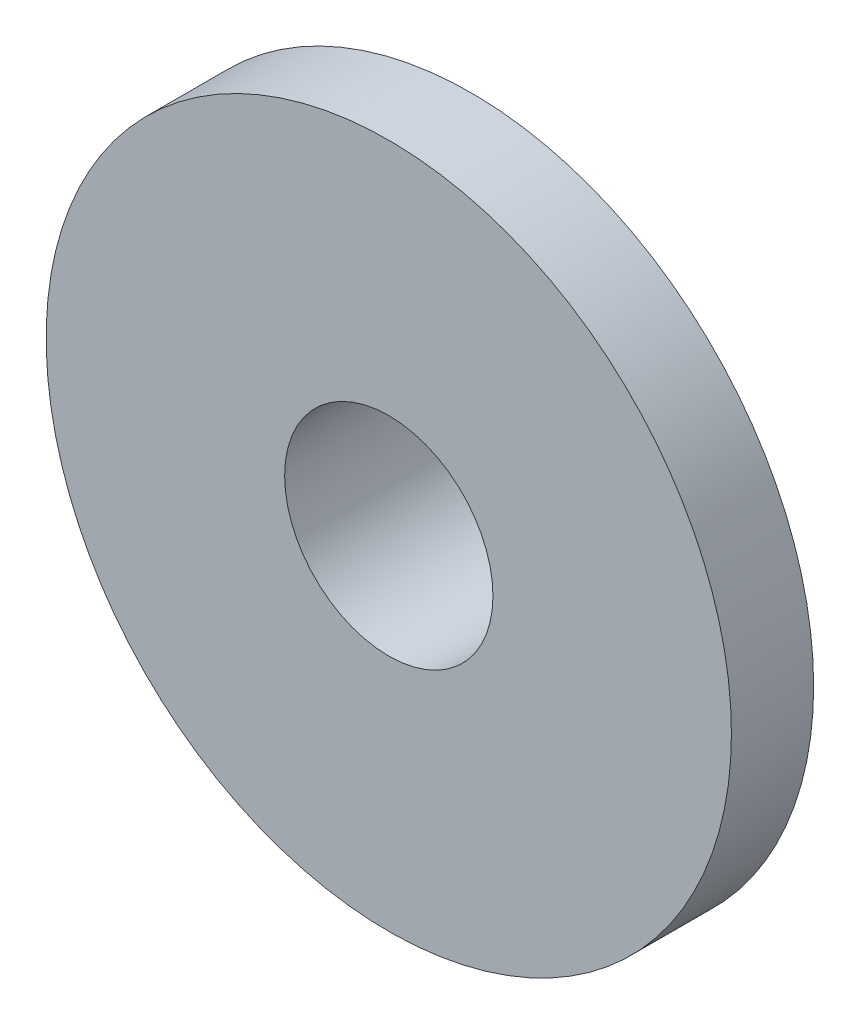
ISO-10303-21;
HEADER;
FILE_DESCRIPTION(('STEP AP214'),'2;1');
FILE_NAME('part.step','',(''),(''),'','','');
FILE_SCHEMA(('AUTOMOTIVE_DESIGN { 1 0 10303 214 1 1 1 1 }'));
ENDSEC;
DATA;
#1=APPLICATION_CONTEXT('core data for automotive mechanical design processes');
#2=APPLICATION_PROTOCOL_DEFINITION('international standard','automotive_design',2000,#1);
#3=PRODUCT_CONTEXT('',#1,'mechanical');
#4=PRODUCT('Part','Part','',(#3));
#5=PRODUCT_RELATED_PRODUCT_CATEGORY('part','',(#4));
#6=PRODUCT_DEFINITION_FORMATION('','',#4);
#7=PRODUCT_DEFINITION_CONTEXT('part definition',#1,'design');
#8=PRODUCT_DEFINITION('design','',#6,#7);
#9=PRODUCT_DEFINITION_SHAPE('','',#8);
#10=(LENGTH_UNIT() NAMED_UNIT(*) SI_UNIT(.MILLI.,.METRE.));
#11=(NAMED_UNIT(*) PLANE_ANGLE_UNIT() SI_UNIT($,.RADIAN.));
#12=(NAMED_UNIT(*) SI_UNIT($,.STERADIAN.) SOLID_ANGLE_UNIT());
#13=UNCERTAINTY_MEASURE_WITH_UNIT(LENGTH_MEASURE(1.E-05),#10,'distance_accuracy_value','');
#14=(GEOMETRIC_REPRESENTATION_CONTEXT(3) GLOBAL_UNCERTAINTY_ASSIGNED_CONTEXT((#13)) GLOBAL_UNIT_ASSIGNED_CONTEXT((#10,
#11,#12)) REPRESENTATION_CONTEXT('',''));
#15=CARTESIAN_POINT('',(0.,0.,0.));
#16=DIRECTION('',(0.,0.,1.));
#17=DIRECTION('',(1.,0.,0.));
#18=AXIS2_PLACEMENT_3D('',#15,#16,#17);
#19=CARTESIAN_POINT('',(0.,0.,13.));
#20=DIRECTION('',(0.,0.,-1.));
#21=DIRECTION('',(-1.,0.,0.));
#22=AXIS2_PLACEMENT_3D('',#19,#20,#21);
#23=CYLINDRICAL_SURFACE('',#22,11.5);
#24=CARTESIAN_POINT('',(0.,0.,0.));
#25=DIRECTION('',(0.,0.,1.));
#26=DIRECTION('',(1.,0.,0.));
#27=AXIS2_PLACEMENT_3D('',#24,#25,#26);
#28=CIRCLE('',#27,11.5);
#29=CARTESIAN_POINT('',(-11.5,0.,0.));
#30=VERTEX_POINT('',#29);
#31=EDGE_CURVE('E46',#30,#30,#28,.T.);
#32=CARTESIAN_POINT('',(0.,0.,7.));
#33=DIRECTION('',(0.,0.,1.));
#34=DIRECTION('',(1.,0.,0.));
#35=AXIS2_PLACEMENT_3D('',#32,#33,#34);
#36=CIRCLE('',#35,11.5);
#37=CARTESIAN_POINT('',(-11.5,0.,7.));
#38=VERTEX_POINT('',#37);
#39=EDGE_CURVE('E10',#38,#38,#36,.T.);
#40=CARTESIAN_POINT('',(-11.5,0.,0.));
#41=CARTESIAN_POINT('',(-11.5,0.,0.0729166666666666));
#42=CARTESIAN_POINT('',(-11.5,0.,0.145833333333333));
#43=CARTESIAN_POINT('',(-11.5,0.,0.291666666666667));
#44=CARTESIAN_POINT('',(-11.5,0.,0.364583333333334));
#45=CARTESIAN_POINT('',(-11.5,0.,0.510416666666667));
#46=CARTESIAN_POINT('',(-11.5,0.,0.583333333333334));
#47=CARTESIAN_POINT('',(-11.5,0.,0.729166666666667));
#48=CARTESIAN_POINT('',(-11.5,0.,0.802083333333334));
#49=CARTESIAN_POINT('',(-11.5,0.,0.947916666666667));
#50=CARTESIAN_POINT('',(-11.5,0.,1.02083333333333));
#51=CARTESIAN_POINT('',(-11.5,0.,1.16666666666667));
#52=CARTESIAN_POINT('',(-11.5,0.,1.23958333333333));
#53=CARTESIAN_POINT('',(-11.5,0.,1.38541666666667));
#54=CARTESIAN_POINT('',(-11.5,0.,1.45833333333333));
#55=CARTESIAN_POINT('',(-11.5,0.,1.60416666666667));
#56=CARTESIAN_POINT('',(-11.5,0.,1.67708333333333));
#57=CARTESIAN_POINT('',(-11.5,0.,1.82291666666667));
#58=CARTESIAN_POINT('',(-11.5,0.,1.89583333333333));
#59=CARTESIAN_POINT('',(-11.5,0.,2.04166666666667));
#60=CARTESIAN_POINT('',(-11.5,0.,2.11458333333333));
#61=CARTESIAN_POINT('',(-11.5,0.,2.26041666666667));
#62=CARTESIAN_POINT('',(-11.5,0.,2.33333333333333));
#63=CARTESIAN_POINT('',(-11.5,0.,2.47916666666667));
#64=CARTESIAN_POINT('',(-11.5,0.,2.55208333333333));
#65=CARTESIAN_POINT('',(-11.5,0.,2.69791666666667));
#66=CARTESIAN_POINT('',(-11.5,0.,2.77083333333333));
#67=CARTESIAN_POINT('',(-11.5,0.,2.91666666666667));
#68=CARTESIAN_POINT('',(-11.5,0.,2.98958333333333));
#69=CARTESIAN_POINT('',(-11.5,0.,3.13541666666667));
#70=CARTESIAN_POINT('',(-11.5,0.,3.20833333333333));
#71=CARTESIAN_POINT('',(-11.5,0.,3.35416666666667));
#72=CARTESIAN_POINT('',(-11.5,0.,3.42708333333333));
#73=CARTESIAN_POINT('',(-11.5,0.,3.57291666666667));
#74=CARTESIAN_POINT('',(-11.5,0.,3.64583333333333));
#75=CARTESIAN_POINT('',(-11.5,0.,3.79166666666667));
#76=CARTESIAN_POINT('',(-11.5,0.,3.86458333333333));
#77=CARTESIAN_POINT('',(-11.5,0.,4.01041666666667));
#78=CARTESIAN_POINT('',(-11.5,0.,4.08333333333333));
#79=CARTESIAN_POINT('',(-11.5,0.,4.22916666666667));
#80=CARTESIAN_POINT('',(-11.5,0.,4.30208333333333));
#81=CARTESIAN_POINT('',(-11.5,0.,4.44791666666667));
#82=CARTESIAN_POINT('',(-11.5,0.,4.52083333333333));
#83=CARTESIAN_POINT('',(-11.5,0.,4.66666666666667));
#84=CARTESIAN_POINT('',(-11.5,0.,4.73958333333333));
#85=CARTESIAN_POINT('',(-11.5,0.,4.88541666666667));
#86=CARTESIAN_POINT('',(-11.5,0.,4.95833333333333));
#87=CARTESIAN_POINT('',(-11.5,0.,5.10416666666667));
#88=CARTESIAN_POINT('',(-11.5,0.,5.17708333333333));
#89=CARTESIAN_POINT('',(-11.5,0.,5.32291666666667));
#90=CARTESIAN_POINT('',(-11.5,0.,5.39583333333333));
#91=CARTESIAN_POINT('',(-11.5,0.,5.54166666666667));
#92=CARTESIAN_POINT('',(-11.5,0.,5.61458333333333));
#93=CARTESIAN_POINT('',(-11.5,0.,5.76041666666667));
#94=CARTESIAN_POINT('',(-11.5,0.,5.83333333333333));
#95=CARTESIAN_POINT('',(-11.5,0.,5.97916666666667));
#96=CARTESIAN_POINT('',(-11.5,0.,6.05208333333333));
#97=CARTESIAN_POINT('',(-11.5,0.,6.19791666666667));
#98=CARTESIAN_POINT('',(-11.5,0.,6.27083333333333));
#99=CARTESIAN_POINT('',(-11.5,0.,6.41666666666667));
#100=CARTESIAN_POINT('',(-11.5,0.,6.48958333333333));
#101=CARTESIAN_POINT('',(-11.5,0.,6.63541666666666));
#102=CARTESIAN_POINT('',(-11.5,0.,6.70833333333333));
#103=CARTESIAN_POINT('',(-11.5,0.,6.85416666666666));
#104=CARTESIAN_POINT('',(-11.5,0.,6.92708333333333));
#105=CARTESIAN_POINT('',(-11.5,0.,7.));
#106=B_SPLINE_CURVE_WITH_KNOTS('',3,(#40,#41,#42,#43,#44,#45,#46,#47,#48,#49,#50,#51,#52,#53,
#54,#55,#56,#57,#58,#59,#60,#61,#62,#63,#64,#65,#66,#67,#68,#69,#70,#71,#72,#73,#74,#75,#76,#77,
#78,#79,#80,#81,#82,#83,#84,#85,#86,#87,#88,#89,#90,#91,#92,#93,#94,#95,#96,#97,#98,#99,#100,
#101,#102,#103,#104,#105),.UNSPECIFIED.,.F.,.F.,(4,2,2,2,2,2,2,2,2,2,2,2,2,2,2,2,2,2,2,2,2,2,2,
2,2,2,2,2,2,2,2,2,4),(0.,0.21875,0.4375,0.656250000000001,0.875000000000001,1.09375,1.3125,
1.53125,1.75,1.96875,2.1875,2.40625,2.625,2.84375,3.0625,3.28125,3.5,3.71875,3.9375,4.15625,
4.375,4.59375,4.8125,5.03125,5.25,5.46875,5.6875,5.90625,6.125,6.34375,6.5625,6.78125,7.),.UNSPECIFIED.);
#107=EDGE_CURVE('BSEAM40',#30,#38,#106,.T.);
#108=ORIENTED_EDGE('',*,*,#31,.T.);
#109=ORIENTED_EDGE('',*,*,#39,.F.);
#110=ORIENTED_EDGE('',*,*,#107,.T.);
#111=ORIENTED_EDGE('',*,*,#107,.F.);
#112=EDGE_LOOP('',(#108,#110,#109,#111));
#113=FACE_BOUND('',#112,.T.);
#114=ADVANCED_FACE('F40',(#113),#23,.T.);
#115=CARTESIAN_POINT('',(0.,0.,0.));
#116=DIRECTION('',(0.,0.,1.));
#117=DIRECTION('',(1.,0.,0.));
#118=AXIS2_PLACEMENT_3D('',#115,#116,#117);
#119=PLANE('',#118);
#120=CARTESIAN_POINT('',(0.,0.,0.));
#121=DIRECTION('',(0.,0.,1.));
#122=DIRECTION('',(1.,0.,0.));
#123=AXIS2_PLACEMENT_3D('',#120,#121,#122);
#124=CIRCLE('',#123,7.6);
#125=CARTESIAN_POINT('',(7.6,0.,0.));
#126=VERTEX_POINT('',#125);
#127=EDGE_CURVE('E58',#126,#126,#124,.T.);
#128=ORIENTED_EDGE('',*,*,#127,.T.);
#129=EDGE_LOOP('',(#128));
#130=FACE_BOUND('',#129,.T.);
#131=ORIENTED_EDGE('',*,*,#31,.F.);
#132=EDGE_LOOP('',(#131));
#133=FACE_BOUND('',#132,.T.);
#134=ADVANCED_FACE('F66',(#130,#133),#119,.F.);
#135=CARTESIAN_POINT('',(0.,0.,7.));
#136=DIRECTION('',(0.,0.,1.));
#137=DIRECTION('',(1.,0.,0.));
#138=AXIS2_PLACEMENT_3D('',#135,#136,#137);
#139=CYLINDRICAL_SURFACE('',#138,25.);
#140=CARTESIAN_POINT('',(0.,0.,7.));
#141=DIRECTION('',(0.,0.,1.));
#142=DIRECTION('',(1.,0.,0.));
#143=AXIS2_PLACEMENT_3D('',#140,#141,#142);
#144=CIRCLE('',#143,25.);
#145=CARTESIAN_POINT('',(25.,0.,7.));
#146=VERTEX_POINT('',#145);
#147=EDGE_CURVE('E50',#146,#146,#144,.T.);
#148=ORIENTED_EDGE('',*,*,#147,.T.);
#149=EDGE_LOOP('',(#148));
#150=FACE_BOUND('',#149,.T.);
#151=CARTESIAN_POINT('',(0.,0.,13.));
#152=DIRECTION('',(0.,0.,1.));
#153=DIRECTION('',(1.,0.,0.));
#154=AXIS2_PLACEMENT_3D('',#151,#152,#153);
#155=CIRCLE('',#154,25.);
#156=CARTESIAN_POINT('',(25.,0.,13.));
#157=VERTEX_POINT('',#156);
#158=EDGE_CURVE('E54',#157,#157,#155,.T.);
#159=ORIENTED_EDGE('',*,*,#158,.F.);
#160=EDGE_LOOP('',(#159));
#161=FACE_BOUND('',#160,.T.);
#162=ADVANCED_FACE('F82',(#150,#161),#139,.T.);
#163=CARTESIAN_POINT('',(0.,0.,7.));
#164=DIRECTION('',(0.,0.,1.));
#165=DIRECTION('',(1.,0.,0.));
#166=AXIS2_PLACEMENT_3D('',#163,#164,#165);
#167=PLANE('',#166);
#168=ORIENTED_EDGE('',*,*,#39,.T.);
#169=EDGE_LOOP('',(#168));
#170=FACE_BOUND('',#169,.T.);
#171=ORIENTED_EDGE('',*,*,#147,.F.);
#172=EDGE_LOOP('',(#171));
#173=FACE_BOUND('',#172,.T.);
#174=ADVANCED_FACE('F78',(#170,#173),#167,.F.);
#175=CARTESIAN_POINT('',(0.,0.,13.));
#176=DIRECTION('',(0.,0.,1.));
#177=DIRECTION('',(1.,0.,0.));
#178=AXIS2_PLACEMENT_3D('',#175,#176,#177);
#179=PLANE('',#178);
#180=CARTESIAN_POINT('',(0.,0.,13.));
#181=DIRECTION('',(0.,0.,1.));
#182=DIRECTION('',(1.,0.,0.));
#183=AXIS2_PLACEMENT_3D('',#180,#181,#182);
#184=CIRCLE('',#183,7.6);
#185=CARTESIAN_POINT('',(7.6,0.,13.));
#186=VERTEX_POINT('',#185);
#187=EDGE_CURVE('E60',#186,#186,#184,.T.);
#188=ORIENTED_EDGE('',*,*,#187,.F.);
#189=EDGE_LOOP('',(#188));
#190=FACE_BOUND('',#189,.T.);
#191=ORIENTED_EDGE('',*,*,#158,.T.);
#192=EDGE_LOOP('',(#191));
#193=FACE_BOUND('',#192,.T.);
#194=ADVANCED_FACE('F72',(#190,#193),#179,.T.);
#195=CARTESIAN_POINT('',(0.,0.,0.));
#196=DIRECTION('',(0.,0.,1.));
#197=DIRECTION('',(1.,0.,0.));
#198=AXIS2_PLACEMENT_3D('',#195,#196,#197);
#199=CYLINDRICAL_SURFACE('',#198,7.6);
#200=CARTESIAN_POINT('',(7.6,0.,0.));
#201=CARTESIAN_POINT('',(7.6,0.,0.135416666666666));
#202=CARTESIAN_POINT('',(7.6,0.,0.270833333333333));
#203=CARTESIAN_POINT('',(7.6,0.,0.541666666666667));
#204=CARTESIAN_POINT('',(7.6,0.,0.677083333333333));
#205=CARTESIAN_POINT('',(7.6,0.,0.947916666666667));
#206=CARTESIAN_POINT('',(7.6,0.,1.08333333333333));
#207=CARTESIAN_POINT('',(7.6,0.,1.35416666666667));
#208=CARTESIAN_POINT('',(7.6,0.,1.48958333333333));
#209=CARTESIAN_POINT('',(7.6,0.,1.76041666666667));
#210=CARTESIAN_POINT('',(7.6,0.,1.89583333333333));
#211=CARTESIAN_POINT('',(7.6,0.,2.16666666666667));
#212=CARTESIAN_POINT('',(7.6,0.,2.30208333333333));
#213=CARTESIAN_POINT('',(7.6,0.,2.57291666666667));
#214=CARTESIAN_POINT('',(7.6,0.,2.70833333333333));
#215=CARTESIAN_POINT('',(7.6,0.,2.97916666666667));
#216=CARTESIAN_POINT('',(7.6,0.,3.11458333333333));
#217=CARTESIAN_POINT('',(7.6,0.,3.38541666666667));
#218=CARTESIAN_POINT('',(7.6,0.,3.52083333333333));
#219=CARTESIAN_POINT('',(7.6,0.,3.79166666666667));
#220=CARTESIAN_POINT('',(7.6,0.,3.92708333333333));
#221=CARTESIAN_POINT('',(7.6,0.,4.19791666666667));
#222=CARTESIAN_POINT('',(7.6,0.,4.33333333333333));
#223=CARTESIAN_POINT('',(7.6,0.,4.60416666666667));
#224=CARTESIAN_POINT('',(7.6,0.,4.73958333333333));
#225=CARTESIAN_POINT('',(7.6,0.,5.01041666666667));
#226=CARTESIAN_POINT('',(7.6,0.,5.14583333333333));
#227=CARTESIAN_POINT('',(7.6,0.,5.41666666666667));
#228=CARTESIAN_POINT('',(7.6,0.,5.55208333333333));
#229=CARTESIAN_POINT('',(7.6,0.,5.82291666666667));
#230=CARTESIAN_POINT('',(7.6,0.,5.95833333333333));
#231=CARTESIAN_POINT('',(7.6,0.,6.22916666666667));
#232=CARTESIAN_POINT('',(7.6,0.,6.36458333333333));
#233=CARTESIAN_POINT('',(7.6,0.,6.63541666666667));
#234=CARTESIAN_POINT('',(7.6,0.,6.77083333333333));
#235=CARTESIAN_POINT('',(7.6,0.,7.04166666666667));
#236=CARTESIAN_POINT('',(7.6,0.,7.17708333333333));
#237=CARTESIAN_POINT('',(7.6,0.,7.44791666666667));
#238=CARTESIAN_POINT('',(7.6,0.,7.58333333333333));
#239=CARTESIAN_POINT('',(7.6,0.,7.85416666666667));
#240=CARTESIAN_POINT('',(7.6,0.,7.98958333333333));
#241=CARTESIAN_POINT('',(7.6,0.,8.26041666666667));
#242=CARTESIAN_POINT('',(7.6,0.,8.39583333333333));
#243=CARTESIAN_POINT('',(7.6,0.,8.66666666666667));
#244=CARTESIAN_POINT('',(7.6,0.,8.80208333333333));
#245=CARTESIAN_POINT('',(7.6,0.,9.07291666666667));
#246=CARTESIAN_POINT('',(7.6,0.,9.20833333333333));
#247=CARTESIAN_POINT('',(7.6,0.,9.47916666666667));
#248=CARTESIAN_POINT('',(7.6,0.,9.61458333333333));
#249=CARTESIAN_POINT('',(7.6,0.,9.88541666666667));
#250=CARTESIAN_POINT('',(7.6,0.,10.0208333333333));
#251=CARTESIAN_POINT('',(7.6,0.,10.2916666666667));
#252=CARTESIAN_POINT('',(7.6,0.,10.4270833333333));
#253=CARTESIAN_POINT('',(7.6,0.,10.6979166666667));
#254=CARTESIAN_POINT('',(7.6,0.,10.8333333333333));
#255=CARTESIAN_POINT('',(7.6,0.,11.1041666666667));
#256=CARTESIAN_POINT('',(7.6,0.,11.2395833333333));
#257=CARTESIAN_POINT('',(7.6,0.,11.5104166666667));
#258=CARTESIAN_POINT('',(7.6,0.,11.6458333333333));
#259=CARTESIAN_POINT('',(7.6,0.,11.9166666666667));
#260=CARTESIAN_POINT('',(7.6,0.,12.0520833333333));
#261=CARTESIAN_POINT('',(7.6,0.,12.3229166666667));
#262=CARTESIAN_POINT('',(7.6,0.,12.4583333333333));
#263=CARTESIAN_POINT('',(7.6,0.,12.7291666666667));
#264=CARTESIAN_POINT('',(7.6,0.,12.8645833333333));
#265=CARTESIAN_POINT('',(7.6,0.,13.));
#266=B_SPLINE_CURVE_WITH_KNOTS('',3,(#200,#201,#202,#203,#204,#205,#206,#207,#208,#209,#210,
#211,#212,#213,#214,#215,#216,#217,#218,#219,#220,#221,#222,#223,#224,#225,#226,#227,#228,#229,
#230,#231,#232,#233,#234,#235,#236,#237,#238,#239,#240,#241,#242,#243,#244,#245,#246,#247,#248,
#249,#250,#251,#252,#253,#254,#255,#256,#257,#258,#259,#260,#261,#262,#263,#264,#265),
.UNSPECIFIED.,.F.,.F.,(4,2,2,2,2,2,2,2,2,2,2,2,2,2,2,2,2,2,2,2,2,2,2,2,2,2,2,2,2,2,2,2,4),(0.,
0.40625,0.8125,1.21875,1.625,2.03125,2.4375,2.84375,3.25,3.65625,4.0625,4.46875,4.875,5.28125,
5.6875,6.09375,6.5,6.90625,7.3125,7.71875,8.125,8.53125,8.9375,9.34375,9.75,10.15625,10.5625,
10.96875,11.375,11.78125,12.1875,12.59375,13.),.UNSPECIFIED.);
#267=EDGE_CURVE('BSEAM69',#126,#186,#266,.T.);
#268=ORIENTED_EDGE('',*,*,#127,.F.);
#269=ORIENTED_EDGE('',*,*,#187,.T.);
#270=ORIENTED_EDGE('',*,*,#267,.T.);
#271=ORIENTED_EDGE('',*,*,#267,.F.);
#272=EDGE_LOOP('',(#268,#270,#269,#271));
#273=FACE_BOUND('',#272,.T.);
#274=ADVANCED_FACE('F69',(#273),#199,.F.);
#275=CLOSED_SHELL('',(#114,#134,#162,#174,#194,#274));
#276=MANIFOLD_SOLID_BREP('B2',#275);
#277=ADVANCED_BREP_SHAPE_REPRESENTATION('',(#18,#276),#14);
#278=SHAPE_DEFINITION_REPRESENTATION(#9,#277);
ENDSEC;
END-ISO-10303-21;
